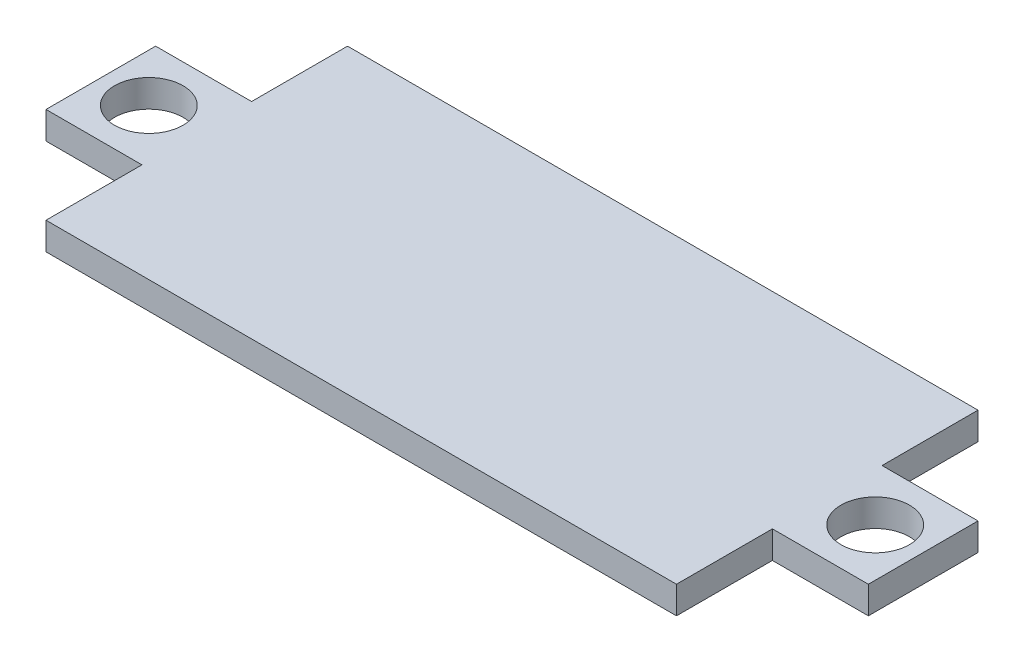
ISO-10303-21;
HEADER;
FILE_DESCRIPTION(('STEP AP214'),'2;1');
FILE_NAME('part.step','',(''),(''),'','','');
FILE_SCHEMA(('AUTOMOTIVE_DESIGN { 1 0 10303 214 1 1 1 1 }'));
ENDSEC;
DATA;
#1=APPLICATION_CONTEXT('core data for automotive mechanical design processes');
#2=APPLICATION_PROTOCOL_DEFINITION('international standard','automotive_design',2000,#1);
#3=PRODUCT_CONTEXT('',#1,'mechanical');
#4=PRODUCT('Part','Part','',(#3));
#5=PRODUCT_RELATED_PRODUCT_CATEGORY('part','',(#4));
#6=PRODUCT_DEFINITION_FORMATION('','',#4);
#7=PRODUCT_DEFINITION_CONTEXT('part definition',#1,'design');
#8=PRODUCT_DEFINITION('design','',#6,#7);
#9=PRODUCT_DEFINITION_SHAPE('','',#8);
#10=(LENGTH_UNIT() NAMED_UNIT(*) SI_UNIT(.MILLI.,.METRE.));
#11=(NAMED_UNIT(*) PLANE_ANGLE_UNIT() SI_UNIT($,.RADIAN.));
#12=(NAMED_UNIT(*) SI_UNIT($,.STERADIAN.) SOLID_ANGLE_UNIT());
#13=UNCERTAINTY_MEASURE_WITH_UNIT(LENGTH_MEASURE(1.E-05),#10,'distance_accuracy_value','');
#14=(GEOMETRIC_REPRESENTATION_CONTEXT(3) GLOBAL_UNCERTAINTY_ASSIGNED_CONTEXT((#13)) GLOBAL_UNIT_ASSIGNED_CONTEXT((#10,
#11,#12)) REPRESENTATION_CONTEXT('',''));
#15=CARTESIAN_POINT('',(0.,0.,0.));
#16=DIRECTION('',(0.,0.,1.));
#17=DIRECTION('',(1.,0.,0.));
#18=AXIS2_PLACEMENT_3D('',#15,#16,#17);
#19=CARTESIAN_POINT('',(0.,1.,0.));
#20=DIRECTION('',(0.,1.,0.));
#21=DIRECTION('',(0.,0.,1.));
#22=AXIS2_PLACEMENT_3D('',#19,#20,#21);
#23=PLANE('',#22);
#24=CARTESIAN_POINT('',(1.28949502575315,1.,-8.22988679244044));
#25=DIRECTION('',(0.,1.,0.));
#26=DIRECTION('',(0.,0.,1.));
#27=AXIS2_PLACEMENT_3D('',#24,#25,#26);
#28=CIRCLE('',#27,1.25);
#29=CARTESIAN_POINT('',(1.28949502575315,1.,-6.97988679244044));
#30=VERTEX_POINT('',#29);
#31=EDGE_CURVE('E170',#30,#30,#28,.T.);
#32=ORIENTED_EDGE('',*,*,#31,.F.);
#33=EDGE_LOOP('',(#32));
#34=FACE_BOUND('',#33,.T.);
#35=DIRECTION('',(0.,0.,1.));
#36=VECTOR('',#35,1.);
#37=CARTESIAN_POINT('',(-23.4605049742468,1.,-13.7298867924404));
#38=LINE('',#37,#36);
#39=CARTESIAN_POINT('',(-23.4605049742468,1.,-13.7298867924404));
#40=VERTEX_POINT('',#39);
#41=CARTESIAN_POINT('',(-23.4605049742468,1.,-10.2298867924404));
#42=VERTEX_POINT('',#41);
#43=EDGE_CURVE('E200',#40,#42,#38,.T.);
#44=ORIENTED_EDGE('',*,*,#43,.T.);
#45=DIRECTION('',(-1.,0.,0.));
#46=VECTOR('',#45,1.);
#47=CARTESIAN_POINT('',(-26.9605049742468,1.,-10.2298867924404));
#48=LINE('',#47,#46);
#49=CARTESIAN_POINT('',(-26.9605049742468,1.,-10.2298867924404));
#50=VERTEX_POINT('',#49);
#51=EDGE_CURVE('E112',#42,#50,#48,.T.);
#52=ORIENTED_EDGE('',*,*,#51,.T.);
#53=DIRECTION('',(0.,0.,1.));
#54=VECTOR('',#53,1.);
#55=CARTESIAN_POINT('',(-26.9605049742468,1.,-10.2298867924404));
#56=LINE('',#55,#54);
#57=CARTESIAN_POINT('',(-26.9605049742468,1.,-6.22988679244044));
#58=VERTEX_POINT('',#57);
#59=EDGE_CURVE('E237',#50,#58,#56,.T.);
#60=ORIENTED_EDGE('',*,*,#59,.T.);
#61=DIRECTION('',(1.,0.,0.));
#62=VECTOR('',#61,1.);
#63=CARTESIAN_POINT('',(-26.9605049742468,1.,-6.22988679244044));
#64=LINE('',#63,#62);
#65=CARTESIAN_POINT('',(-23.4605049742468,1.,-6.22988679244044));
#66=VERTEX_POINT('',#65);
#67=EDGE_CURVE('E257',#58,#66,#64,.T.);
#68=ORIENTED_EDGE('',*,*,#67,.T.);
#69=DIRECTION('',(0.,0.,1.));
#70=VECTOR('',#69,1.);
#71=CARTESIAN_POINT('',(-23.4605049742468,1.,-2.72988679244044));
#72=LINE('',#71,#70);
#73=CARTESIAN_POINT('',(-23.4605049742468,1.,-2.72988679244044));
#74=VERTEX_POINT('',#73);
#75=EDGE_CURVE('E253',#66,#74,#72,.T.);
#76=ORIENTED_EDGE('',*,*,#75,.T.);
#77=DIRECTION('',(1.,0.,0.));
#78=VECTOR('',#77,1.);
#79=CARTESIAN_POINT('',(-23.4605049742468,1.,-2.72988679244044));
#80=LINE('',#79,#78);
#81=CARTESIAN_POINT('',(-0.460504974246847,1.,-2.72988679244044));
#82=VERTEX_POINT('',#81);
#83=EDGE_CURVE('E256',#74,#82,#80,.T.);
#84=ORIENTED_EDGE('',*,*,#83,.T.);
#85=DIRECTION('',(0.,0.,-1.));
#86=VECTOR('',#85,1.);
#87=CARTESIAN_POINT('',(-0.460504974246847,1.,-2.72988679244044));
#88=LINE('',#87,#86);
#89=CARTESIAN_POINT('',(-0.460504974246847,1.,-6.22988679244044));
#90=VERTEX_POINT('',#89);
#91=EDGE_CURVE('E261',#82,#90,#88,.T.);
#92=ORIENTED_EDGE('',*,*,#91,.T.);
#93=DIRECTION('',(1.,0.,0.));
#94=VECTOR('',#93,1.);
#95=CARTESIAN_POINT('',(3.03949502575315,1.,-6.22988679244044));
#96=LINE('',#95,#94);
#97=CARTESIAN_POINT('',(3.03949502575315,1.,-6.22988679244044));
#98=VERTEX_POINT('',#97);
#99=EDGE_CURVE('E268',#90,#98,#96,.T.);
#100=ORIENTED_EDGE('',*,*,#99,.T.);
#101=DIRECTION('',(0.,0.,-1.));
#102=VECTOR('',#101,1.);
#103=CARTESIAN_POINT('',(3.03949502575315,1.,-10.2298867924404));
#104=LINE('',#103,#102);
#105=CARTESIAN_POINT('',(3.03949502575315,1.,-10.2298867924404));
#106=VERTEX_POINT('',#105);
#107=EDGE_CURVE('E143',#98,#106,#104,.T.);
#108=ORIENTED_EDGE('',*,*,#107,.T.);
#109=DIRECTION('',(-1.,0.,0.));
#110=VECTOR('',#109,1.);
#111=CARTESIAN_POINT('',(3.03949502575315,1.,-10.2298867924404));
#112=LINE('',#111,#110);
#113=CARTESIAN_POINT('',(-0.460504974246847,1.,-10.2298867924404));
#114=VERTEX_POINT('',#113);
#115=EDGE_CURVE('E137',#106,#114,#112,.T.);
#116=ORIENTED_EDGE('',*,*,#115,.T.);
#117=DIRECTION('',(0.,0.,-1.));
#118=VECTOR('',#117,1.);
#119=CARTESIAN_POINT('',(-0.460504974246847,1.,-13.7298867924404));
#120=LINE('',#119,#118);
#121=CARTESIAN_POINT('',(-0.460504974246847,1.,-13.7298867924404));
#122=VERTEX_POINT('',#121);
#123=EDGE_CURVE('E141',#114,#122,#120,.T.);
#124=ORIENTED_EDGE('',*,*,#123,.T.);
#125=DIRECTION('',(-1.,0.,0.));
#126=VECTOR('',#125,1.);
#127=CARTESIAN_POINT('',(-23.4605049742468,1.,-13.7298867924404));
#128=LINE('',#127,#126);
#129=EDGE_CURVE('E57',#122,#40,#128,.T.);
#130=ORIENTED_EDGE('',*,*,#129,.T.);
#131=EDGE_LOOP('',(#44,#52,#60,#68,#76,#84,#92,#100,#108,#116,#124,#130));
#132=FACE_BOUND('',#131,.T.);
#133=CARTESIAN_POINT('',(-25.2105049742468,1.,-8.22988679244044));
#134=DIRECTION('',(0.,1.,0.));
#135=DIRECTION('',(0.,0.,1.));
#136=AXIS2_PLACEMENT_3D('',#133,#134,#135);
#137=CIRCLE('',#136,1.25);
#138=CARTESIAN_POINT('',(-25.2105049742468,1.,-6.97988679244043));
#139=VERTEX_POINT('',#138);
#140=EDGE_CURVE('E312',#139,#139,#137,.T.);
#141=ORIENTED_EDGE('',*,*,#140,.F.);
#142=EDGE_LOOP('',(#141));
#143=FACE_BOUND('',#142,.T.);
#144=ADVANCED_FACE('F39',(#34,#132,#143),#23,.T.);
#145=CARTESIAN_POINT('',(0.,0.,0.));
#146=DIRECTION('',(0.,1.,0.));
#147=DIRECTION('',(0.,0.,1.));
#148=AXIS2_PLACEMENT_3D('',#145,#146,#147);
#149=PLANE('',#148);
#150=DIRECTION('',(0.,0.,1.));
#151=VECTOR('',#150,1.);
#152=CARTESIAN_POINT('',(-23.4605049742468,0.,-13.7298867924404));
#153=LINE('',#152,#151);
#154=CARTESIAN_POINT('',(-23.4605049742468,0.,-13.7298867924404));
#155=VERTEX_POINT('',#154);
#156=CARTESIAN_POINT('',(-23.4605049742468,0.,-10.2298867924404));
#157=VERTEX_POINT('',#156);
#158=EDGE_CURVE('E165',#155,#157,#153,.T.);
#159=ORIENTED_EDGE('',*,*,#158,.F.);
#160=DIRECTION('',(-1.,0.,0.));
#161=VECTOR('',#160,1.);
#162=CARTESIAN_POINT('',(-23.4605049742468,0.,-13.7298867924404));
#163=LINE('',#162,#161);
#164=CARTESIAN_POINT('',(-0.460504974246847,0.,-13.7298867924404));
#165=VERTEX_POINT('',#164);
#166=EDGE_CURVE('E104',#165,#155,#163,.T.);
#167=ORIENTED_EDGE('',*,*,#166,.F.);
#168=DIRECTION('',(0.,0.,-1.));
#169=VECTOR('',#168,1.);
#170=CARTESIAN_POINT('',(-0.460504974246847,0.,-13.7298867924404));
#171=LINE('',#170,#169);
#172=CARTESIAN_POINT('',(-0.460504974246847,0.,-10.2298867924404));
#173=VERTEX_POINT('',#172);
#174=EDGE_CURVE('E98',#173,#165,#171,.T.);
#175=ORIENTED_EDGE('',*,*,#174,.F.);
#176=DIRECTION('',(-1.,0.,0.));
#177=VECTOR('',#176,1.);
#178=CARTESIAN_POINT('',(3.03949502575315,0.,-10.2298867924404));
#179=LINE('',#178,#177);
#180=CARTESIAN_POINT('',(3.03949502575315,0.,-10.2298867924404));
#181=VERTEX_POINT('',#180);
#182=EDGE_CURVE('E152',#181,#173,#179,.T.);
#183=ORIENTED_EDGE('',*,*,#182,.F.);
#184=DIRECTION('',(0.,0.,-1.));
#185=VECTOR('',#184,1.);
#186=CARTESIAN_POINT('',(3.03949502575315,0.,-10.2298867924404));
#187=LINE('',#186,#185);
#188=CARTESIAN_POINT('',(3.03949502575315,0.,-6.22988679244044));
#189=VERTEX_POINT('',#188);
#190=EDGE_CURVE('E191',#189,#181,#187,.T.);
#191=ORIENTED_EDGE('',*,*,#190,.F.);
#192=DIRECTION('',(1.,0.,0.));
#193=VECTOR('',#192,1.);
#194=CARTESIAN_POINT('',(3.03949502575315,0.,-6.22988679244044));
#195=LINE('',#194,#193);
#196=CARTESIAN_POINT('',(-0.460504974246847,0.,-6.22988679244044));
#197=VERTEX_POINT('',#196);
#198=EDGE_CURVE('E188',#197,#189,#195,.T.);
#199=ORIENTED_EDGE('',*,*,#198,.F.);
#200=DIRECTION('',(0.,0.,-1.));
#201=VECTOR('',#200,1.);
#202=CARTESIAN_POINT('',(-0.460504974246847,0.,-2.72988679244044));
#203=LINE('',#202,#201);
#204=CARTESIAN_POINT('',(-0.460504974246847,0.,-2.72988679244044));
#205=VERTEX_POINT('',#204);
#206=EDGE_CURVE('E185',#205,#197,#203,.T.);
#207=ORIENTED_EDGE('',*,*,#206,.F.);
#208=DIRECTION('',(1.,0.,0.));
#209=VECTOR('',#208,1.);
#210=CARTESIAN_POINT('',(-23.4605049742468,0.,-2.72988679244044));
#211=LINE('',#210,#209);
#212=CARTESIAN_POINT('',(-23.4605049742468,0.,-2.72988679244044));
#213=VERTEX_POINT('',#212);
#214=EDGE_CURVE('E182',#213,#205,#211,.T.);
#215=ORIENTED_EDGE('',*,*,#214,.F.);
#216=DIRECTION('',(0.,0.,1.));
#217=VECTOR('',#216,1.);
#218=CARTESIAN_POINT('',(-23.4605049742468,0.,-2.72988679244044));
#219=LINE('',#218,#217);
#220=CARTESIAN_POINT('',(-23.4605049742468,0.,-6.22988679244044));
#221=VERTEX_POINT('',#220);
#222=EDGE_CURVE('E179',#221,#213,#219,.T.);
#223=ORIENTED_EDGE('',*,*,#222,.F.);
#224=DIRECTION('',(1.,0.,0.));
#225=VECTOR('',#224,1.);
#226=CARTESIAN_POINT('',(-26.9605049742468,0.,-6.22988679244044));
#227=LINE('',#226,#225);
#228=CARTESIAN_POINT('',(-26.9605049742468,0.,-6.22988679244044));
#229=VERTEX_POINT('',#228);
#230=EDGE_CURVE('E176',#229,#221,#227,.T.);
#231=ORIENTED_EDGE('',*,*,#230,.F.);
#232=DIRECTION('',(0.,0.,1.));
#233=VECTOR('',#232,1.);
#234=CARTESIAN_POINT('',(-26.9605049742468,0.,-10.2298867924404));
#235=LINE('',#234,#233);
#236=CARTESIAN_POINT('',(-26.9605049742468,0.,-10.2298867924404));
#237=VERTEX_POINT('',#236);
#238=EDGE_CURVE('E173',#237,#229,#235,.T.);
#239=ORIENTED_EDGE('',*,*,#238,.F.);
#240=DIRECTION('',(-1.,0.,0.));
#241=VECTOR('',#240,1.);
#242=CARTESIAN_POINT('',(-26.9605049742468,0.,-10.2298867924404));
#243=LINE('',#242,#241);
#244=EDGE_CURVE('E169',#157,#237,#243,.T.);
#245=ORIENTED_EDGE('',*,*,#244,.F.);
#246=EDGE_LOOP('',(#159,#167,#175,#183,#191,#199,#207,#215,#223,#231,#239,#245));
#247=FACE_BOUND('',#246,.T.);
#248=CARTESIAN_POINT('',(1.28949502575315,0.,-8.22988679244044));
#249=DIRECTION('',(0.,1.,0.));
#250=DIRECTION('',(0.,0.,1.));
#251=AXIS2_PLACEMENT_3D('',#248,#249,#250);
#252=CIRCLE('',#251,1.25);
#253=CARTESIAN_POINT('',(1.28949502575315,0.,-6.97988679244044));
#254=VERTEX_POINT('',#253);
#255=EDGE_CURVE('E320',#254,#254,#252,.T.);
#256=ORIENTED_EDGE('',*,*,#255,.T.);
#257=EDGE_LOOP('',(#256));
#258=FACE_BOUND('',#257,.T.);
#259=CARTESIAN_POINT('',(-25.2105049742468,0.,-8.22988679244044));
#260=DIRECTION('',(0.,1.,0.));
#261=DIRECTION('',(0.,0.,1.));
#262=AXIS2_PLACEMENT_3D('',#259,#260,#261);
#263=CIRCLE('',#262,1.25);
#264=CARTESIAN_POINT('',(-25.2105049742468,0.,-6.97988679244043));
#265=VERTEX_POINT('',#264);
#266=EDGE_CURVE('E315',#265,#265,#263,.T.);
#267=ORIENTED_EDGE('',*,*,#266,.T.);
#268=EDGE_LOOP('',(#267));
#269=FACE_BOUND('',#268,.T.);
#270=ADVANCED_FACE('F241',(#247,#258,#269),#149,.F.);
#271=CARTESIAN_POINT('',(-23.4605049742468,1.,-13.7298867924404));
#272=DIRECTION('',(1.,0.,0.));
#273=DIRECTION('',(0.,0.,-1.));
#274=AXIS2_PLACEMENT_3D('',#271,#272,#273);
#275=PLANE('',#274);
#276=ORIENTED_EDGE('',*,*,#158,.T.);
#277=DIRECTION('',(0.,-1.,0.));
#278=VECTOR('',#277,1.);
#279=CARTESIAN_POINT('',(-23.4605049742468,1.,-10.2298867924404));
#280=LINE('',#279,#278);
#281=EDGE_CURVE('E11',#42,#157,#280,.T.);
#282=ORIENTED_EDGE('',*,*,#281,.F.);
#283=ORIENTED_EDGE('',*,*,#43,.F.);
#284=DIRECTION('',(0.,-1.,0.));
#285=VECTOR('',#284,1.);
#286=CARTESIAN_POINT('',(-23.4605049742468,1.,-13.7298867924404));
#287=LINE('',#286,#285);
#288=EDGE_CURVE('E161',#40,#155,#287,.T.);
#289=ORIENTED_EDGE('',*,*,#288,.T.);
#290=EDGE_LOOP('',(#276,#282,#283,#289));
#291=FACE_BOUND('',#290,.T.);
#292=ADVANCED_FACE('F41',(#291),#275,.F.);
#293=CARTESIAN_POINT('',(-26.9605049742468,1.,-10.2298867924404));
#294=DIRECTION('',(0.,0.,1.));
#295=DIRECTION('',(1.,0.,0.));
#296=AXIS2_PLACEMENT_3D('',#293,#294,#295);
#297=PLANE('',#296);
#298=ORIENTED_EDGE('',*,*,#244,.T.);
#299=DIRECTION('',(0.,-1.,0.));
#300=VECTOR('',#299,1.);
#301=CARTESIAN_POINT('',(-26.9605049742468,1.,-10.2298867924404));
#302=LINE('',#301,#300);
#303=EDGE_CURVE('E49',#50,#237,#302,.T.);
#304=ORIENTED_EDGE('',*,*,#303,.F.);
#305=ORIENTED_EDGE('',*,*,#51,.F.);
#306=ORIENTED_EDGE('',*,*,#281,.T.);
#307=EDGE_LOOP('',(#298,#304,#305,#306));
#308=FACE_BOUND('',#307,.T.);
#309=ADVANCED_FACE('F418',(#308),#297,.F.);
#310=CARTESIAN_POINT('',(-26.9605049742468,1.,-10.2298867924404));
#311=DIRECTION('',(1.,0.,0.));
#312=DIRECTION('',(0.,0.,-1.));
#313=AXIS2_PLACEMENT_3D('',#310,#311,#312);
#314=PLANE('',#313);
#315=ORIENTED_EDGE('',*,*,#238,.T.);
#316=DIRECTION('',(0.,-1.,0.));
#317=VECTOR('',#316,1.);
#318=CARTESIAN_POINT('',(-26.9605049742468,1.,-6.22988679244044));
#319=LINE('',#318,#317);
#320=EDGE_CURVE('E227',#58,#229,#319,.T.);
#321=ORIENTED_EDGE('',*,*,#320,.F.);
#322=ORIENTED_EDGE('',*,*,#59,.F.);
#323=ORIENTED_EDGE('',*,*,#303,.T.);
#324=EDGE_LOOP('',(#315,#321,#322,#323));
#325=FACE_BOUND('',#324,.T.);
#326=ADVANCED_FACE('F235',(#325),#314,.F.);
#327=CARTESIAN_POINT('',(-26.9605049742468,1.,-6.22988679244044));
#328=DIRECTION('',(0.,0.,-1.));
#329=DIRECTION('',(-1.,0.,0.));
#330=AXIS2_PLACEMENT_3D('',#327,#328,#329);
#331=PLANE('',#330);
#332=ORIENTED_EDGE('',*,*,#230,.T.);
#333=DIRECTION('',(0.,-1.,0.));
#334=VECTOR('',#333,1.);
#335=CARTESIAN_POINT('',(-23.4605049742468,1.,-6.22988679244044));
#336=LINE('',#335,#334);
#337=EDGE_CURVE('E223',#66,#221,#336,.T.);
#338=ORIENTED_EDGE('',*,*,#337,.F.);
#339=ORIENTED_EDGE('',*,*,#67,.F.);
#340=ORIENTED_EDGE('',*,*,#320,.T.);
#341=EDGE_LOOP('',(#332,#338,#339,#340));
#342=FACE_BOUND('',#341,.T.);
#343=ADVANCED_FACE('F247',(#342),#331,.F.);
#344=CARTESIAN_POINT('',(-23.4605049742468,1.,-2.72988679244044));
#345=DIRECTION('',(1.,0.,0.));
#346=DIRECTION('',(0.,0.,-1.));
#347=AXIS2_PLACEMENT_3D('',#344,#345,#346);
#348=PLANE('',#347);
#349=ORIENTED_EDGE('',*,*,#222,.T.);
#350=DIRECTION('',(0.,-1.,0.));
#351=VECTOR('',#350,1.);
#352=CARTESIAN_POINT('',(-23.4605049742468,1.,-2.72988679244044));
#353=LINE('',#352,#351);
#354=EDGE_CURVE('E219',#74,#213,#353,.T.);
#355=ORIENTED_EDGE('',*,*,#354,.F.);
#356=ORIENTED_EDGE('',*,*,#75,.F.);
#357=ORIENTED_EDGE('',*,*,#337,.T.);
#358=EDGE_LOOP('',(#349,#355,#356,#357));
#359=FACE_BOUND('',#358,.T.);
#360=ADVANCED_FACE('F251',(#359),#348,.F.);
#361=CARTESIAN_POINT('',(-23.4605049742468,1.,-2.72988679244044));
#362=DIRECTION('',(0.,0.,-1.));
#363=DIRECTION('',(-1.,0.,0.));
#364=AXIS2_PLACEMENT_3D('',#361,#362,#363);
#365=PLANE('',#364);
#366=ORIENTED_EDGE('',*,*,#214,.T.);
#367=DIRECTION('',(0.,-1.,0.));
#368=VECTOR('',#367,1.);
#369=CARTESIAN_POINT('',(-0.460504974246847,1.,-2.72988679244044));
#370=LINE('',#369,#368);
#371=EDGE_CURVE('E215',#82,#205,#370,.T.);
#372=ORIENTED_EDGE('',*,*,#371,.F.);
#373=ORIENTED_EDGE('',*,*,#83,.F.);
#374=ORIENTED_EDGE('',*,*,#354,.T.);
#375=EDGE_LOOP('',(#366,#372,#373,#374));
#376=FACE_BOUND('',#375,.T.);
#377=ADVANCED_FACE('F383',(#376),#365,.F.);
#378=CARTESIAN_POINT('',(-0.460504974246847,1.,-2.72988679244044));
#379=DIRECTION('',(-1.,0.,0.));
#380=DIRECTION('',(0.,0.,1.));
#381=AXIS2_PLACEMENT_3D('',#378,#379,#380);
#382=PLANE('',#381);
#383=ORIENTED_EDGE('',*,*,#206,.T.);
#384=DIRECTION('',(0.,-1.,0.));
#385=VECTOR('',#384,1.);
#386=CARTESIAN_POINT('',(-0.460504974246847,1.,-6.22988679244044));
#387=LINE('',#386,#385);
#388=EDGE_CURVE('E211',#90,#197,#387,.T.);
#389=ORIENTED_EDGE('',*,*,#388,.F.);
#390=ORIENTED_EDGE('',*,*,#91,.F.);
#391=ORIENTED_EDGE('',*,*,#371,.T.);
#392=EDGE_LOOP('',(#383,#389,#390,#391));
#393=FACE_BOUND('',#392,.T.);
#394=ADVANCED_FACE('F374',(#393),#382,.F.);
#395=CARTESIAN_POINT('',(3.03949502575315,1.,-6.22988679244044));
#396=DIRECTION('',(0.,0.,-1.));
#397=DIRECTION('',(-1.,0.,0.));
#398=AXIS2_PLACEMENT_3D('',#395,#396,#397);
#399=PLANE('',#398);
#400=ORIENTED_EDGE('',*,*,#198,.T.);
#401=DIRECTION('',(0.,-1.,0.));
#402=VECTOR('',#401,1.);
#403=CARTESIAN_POINT('',(3.03949502575315,1.,-6.22988679244044));
#404=LINE('',#403,#402);
#405=EDGE_CURVE('E207',#98,#189,#404,.T.);
#406=ORIENTED_EDGE('',*,*,#405,.F.);
#407=ORIENTED_EDGE('',*,*,#99,.F.);
#408=ORIENTED_EDGE('',*,*,#388,.T.);
#409=EDGE_LOOP('',(#400,#406,#407,#408));
#410=FACE_BOUND('',#409,.T.);
#411=ADVANCED_FACE('F276',(#410),#399,.F.);
#412=CARTESIAN_POINT('',(3.03949502575315,1.,-10.2298867924404));
#413=DIRECTION('',(-1.,0.,0.));
#414=DIRECTION('',(0.,0.,1.));
#415=AXIS2_PLACEMENT_3D('',#412,#413,#414);
#416=PLANE('',#415);
#417=ORIENTED_EDGE('',*,*,#190,.T.);
#418=DIRECTION('',(0.,-1.,0.));
#419=VECTOR('',#418,1.);
#420=CARTESIAN_POINT('',(3.03949502575315,1.,-10.2298867924404));
#421=LINE('',#420,#419);
#422=EDGE_CURVE('E154',#106,#181,#421,.T.);
#423=ORIENTED_EDGE('',*,*,#422,.F.);
#424=ORIENTED_EDGE('',*,*,#107,.F.);
#425=ORIENTED_EDGE('',*,*,#405,.T.);
#426=EDGE_LOOP('',(#417,#423,#424,#425));
#427=FACE_BOUND('',#426,.T.);
#428=ADVANCED_FACE('F280',(#427),#416,.F.);
#429=CARTESIAN_POINT('',(3.03949502575315,1.,-10.2298867924404));
#430=DIRECTION('',(0.,0.,1.));
#431=DIRECTION('',(1.,0.,0.));
#432=AXIS2_PLACEMENT_3D('',#429,#430,#431);
#433=PLANE('',#432);
#434=ORIENTED_EDGE('',*,*,#182,.T.);
#435=DIRECTION('',(0.,-1.,0.));
#436=VECTOR('',#435,1.);
#437=CARTESIAN_POINT('',(-0.460504974246847,1.,-10.2298867924404));
#438=LINE('',#437,#436);
#439=EDGE_CURVE('E149',#114,#173,#438,.T.);
#440=ORIENTED_EDGE('',*,*,#439,.F.);
#441=ORIENTED_EDGE('',*,*,#115,.F.);
#442=ORIENTED_EDGE('',*,*,#422,.T.);
#443=EDGE_LOOP('',(#434,#440,#441,#442));
#444=FACE_BOUND('',#443,.T.);
#445=ADVANCED_FACE('F150',(#444),#433,.F.);
#446=CARTESIAN_POINT('',(-0.460504974246847,1.,-13.7298867924404));
#447=DIRECTION('',(-1.,0.,0.));
#448=DIRECTION('',(0.,0.,1.));
#449=AXIS2_PLACEMENT_3D('',#446,#447,#448);
#450=PLANE('',#449);
#451=ORIENTED_EDGE('',*,*,#174,.T.);
#452=DIRECTION('',(0.,-1.,0.));
#453=VECTOR('',#452,1.);
#454=CARTESIAN_POINT('',(-0.460504974246847,1.,-13.7298867924404));
#455=LINE('',#454,#453);
#456=EDGE_CURVE('E155',#122,#165,#455,.T.);
#457=ORIENTED_EDGE('',*,*,#456,.F.);
#458=ORIENTED_EDGE('',*,*,#123,.F.);
#459=ORIENTED_EDGE('',*,*,#439,.T.);
#460=EDGE_LOOP('',(#451,#457,#458,#459));
#461=FACE_BOUND('',#460,.T.);
#462=ADVANCED_FACE('F157',(#461),#450,.F.);
#463=CARTESIAN_POINT('',(-23.4605049742468,1.,-13.7298867924404));
#464=DIRECTION('',(0.,0.,1.));
#465=DIRECTION('',(1.,0.,0.));
#466=AXIS2_PLACEMENT_3D('',#463,#464,#465);
#467=PLANE('',#466);
#468=ORIENTED_EDGE('',*,*,#166,.T.);
#469=ORIENTED_EDGE('',*,*,#288,.F.);
#470=ORIENTED_EDGE('',*,*,#129,.F.);
#471=ORIENTED_EDGE('',*,*,#456,.T.);
#472=EDGE_LOOP('',(#468,#469,#470,#471));
#473=FACE_BOUND('',#472,.T.);
#474=ADVANCED_FACE('F284',(#473),#467,.F.);
#475=CARTESIAN_POINT('',(1.28949502575315,1.,-8.22988679244044));
#476=DIRECTION('',(0.,-1.,0.));
#477=DIRECTION('',(0.,0.,-1.));
#478=AXIS2_PLACEMENT_3D('',#475,#476,#477);
#479=CYLINDRICAL_SURFACE('',#478,1.25);
#480=ORIENTED_EDGE('',*,*,#31,.T.);
#481=EDGE_LOOP('',(#480));
#482=FACE_BOUND('',#481,.T.);
#483=ORIENTED_EDGE('',*,*,#255,.F.);
#484=EDGE_LOOP('',(#483));
#485=FACE_BOUND('',#484,.T.);
#486=ADVANCED_FACE('F286',(#482,#485),#479,.F.);
#487=CARTESIAN_POINT('',(-25.2105049742468,1.,-8.22988679244044));
#488=DIRECTION('',(0.,-1.,0.));
#489=DIRECTION('',(0.,0.,-1.));
#490=AXIS2_PLACEMENT_3D('',#487,#488,#489);
#491=CYLINDRICAL_SURFACE('',#490,1.25);
#492=ORIENTED_EDGE('',*,*,#140,.T.);
#493=EDGE_LOOP('',(#492));
#494=FACE_BOUND('',#493,.T.);
#495=ORIENTED_EDGE('',*,*,#266,.F.);
#496=EDGE_LOOP('',(#495));
#497=FACE_BOUND('',#496,.T.);
#498=ADVANCED_FACE('F292',(#494,#497),#491,.F.);
#499=CLOSED_SHELL('',(#144,#270,#292,#309,#326,#343,#360,#377,#394,#411,#428,#445,#462,#474,
#486,#498));
#500=MANIFOLD_SOLID_BREP('B2',#499);
#501=ADVANCED_BREP_SHAPE_REPRESENTATION('',(#18,#500),#14);
#502=SHAPE_DEFINITION_REPRESENTATION(#9,#501);
ENDSEC;
END-ISO-10303-21;
